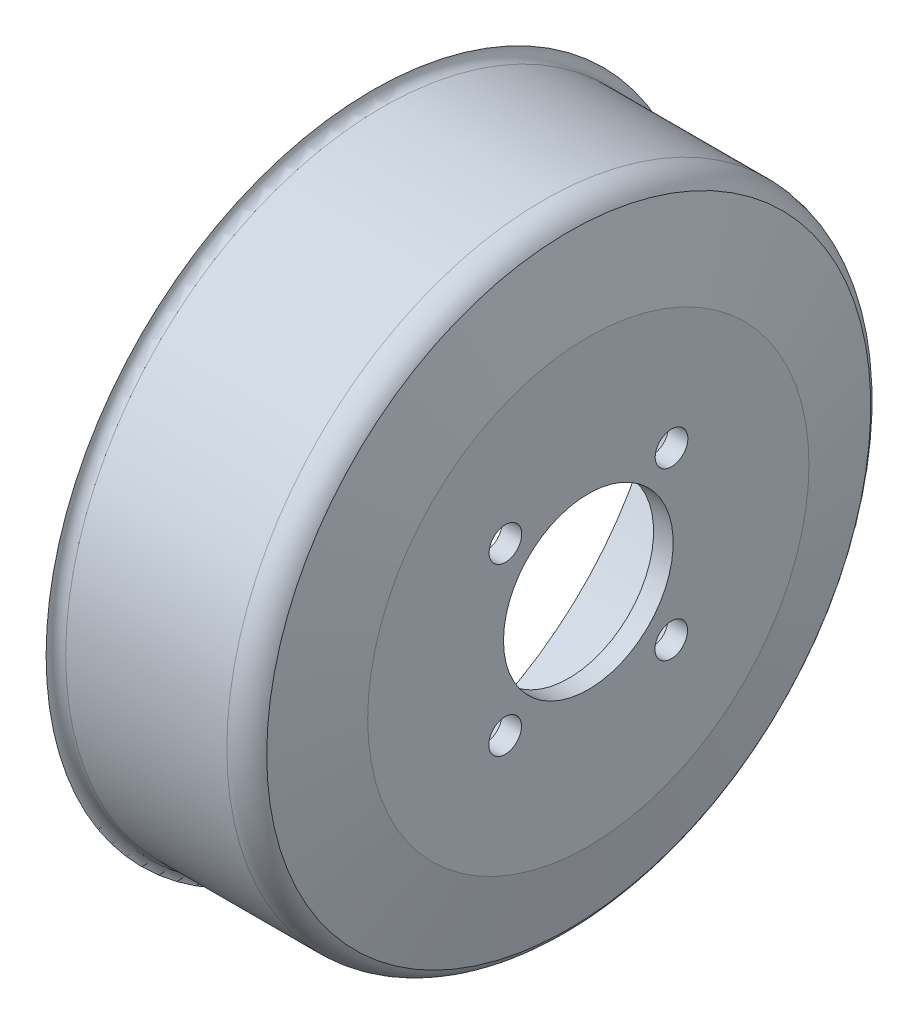
ISO-10303-21;
HEADER;
FILE_DESCRIPTION(('STEP AP214'),'2;1');
FILE_NAME('part.step','',(''),(''),'','','');
FILE_SCHEMA(('AUTOMOTIVE_DESIGN { 1 0 10303 214 1 1 1 1 }'));
ENDSEC;
DATA;
#1=APPLICATION_CONTEXT('core data for automotive mechanical design processes');
#2=APPLICATION_PROTOCOL_DEFINITION('international standard','automotive_design',2000,#1);
#3=PRODUCT_CONTEXT('',#1,'mechanical');
#4=PRODUCT('Part','Part','',(#3));
#5=PRODUCT_RELATED_PRODUCT_CATEGORY('part','',(#4));
#6=PRODUCT_DEFINITION_FORMATION('','',#4);
#7=PRODUCT_DEFINITION_CONTEXT('part definition',#1,'design');
#8=PRODUCT_DEFINITION('design','',#6,#7);
#9=PRODUCT_DEFINITION_SHAPE('','',#8);
#10=(LENGTH_UNIT() NAMED_UNIT(*) SI_UNIT(.MILLI.,.METRE.));
#11=(NAMED_UNIT(*) PLANE_ANGLE_UNIT() SI_UNIT($,.RADIAN.));
#12=(NAMED_UNIT(*) SI_UNIT($,.STERADIAN.) SOLID_ANGLE_UNIT());
#13=UNCERTAINTY_MEASURE_WITH_UNIT(LENGTH_MEASURE(1.E-05),#10,'distance_accuracy_value','');
#14=(GEOMETRIC_REPRESENTATION_CONTEXT(3) GLOBAL_UNCERTAINTY_ASSIGNED_CONTEXT((#13)) GLOBAL_UNIT_ASSIGNED_CONTEXT((#10,
#11,#12)) REPRESENTATION_CONTEXT('',''));
#15=CARTESIAN_POINT('',(0.,0.,0.));
#16=DIRECTION('',(0.,0.,1.));
#17=DIRECTION('',(1.,0.,0.));
#18=AXIS2_PLACEMENT_3D('',#15,#16,#17);
#19=CARTESIAN_POINT('',(72.1520736682351,26.,0.));
#20=DIRECTION('',(1.,0.,0.));
#21=DIRECTION('',(0.,0.,-1.));
#22=AXIS2_PLACEMENT_3D('',#19,#20,#21);
#23=PLANE('',#22);
#24=CARTESIAN_POINT('',(72.1520736682351,-25.4174602035687,25.4941702512555));
#25=DIRECTION('',(1.,0.,0.));
#26=DIRECTION('',(0.,0.,-1.));
#27=AXIS2_PLACEMENT_3D('',#24,#25,#26);
#28=CIRCLE('',#27,5.);
#29=CARTESIAN_POINT('',(72.1520736682351,-25.4174602035687,20.4941702512555));
#30=VERTEX_POINT('',#29);
#31=EDGE_CURVE('E94',#30,#30,#28,.T.);
#32=ORIENTED_EDGE('',*,*,#31,.T.);
#33=EDGE_LOOP('',(#32));
#34=FACE_BOUND('',#33,.T.);
#35=CARTESIAN_POINT('',(72.1520736682351,-25.4958558670303,-25.4157693884646));
#36=DIRECTION('',(1.,0.,0.));
#37=DIRECTION('',(0.,0.,-1.));
#38=AXIS2_PLACEMENT_3D('',#35,#36,#37);
#39=CIRCLE('',#38,5.);
#40=CARTESIAN_POINT('',(72.1520736682351,-25.4958558670303,-30.4157693884646));
#41=VERTEX_POINT('',#40);
#42=EDGE_CURVE('E98',#41,#41,#39,.T.);
#43=ORIENTED_EDGE('',*,*,#42,.T.);
#44=EDGE_LOOP('',(#43));
#45=FACE_BOUND('',#44,.T.);
#46=CARTESIAN_POINT('',(72.1520736682351,25.4141441329697,-25.4974759140712));
#47=DIRECTION('',(1.,0.,0.));
#48=DIRECTION('',(0.,0.,-1.));
#49=AXIS2_PLACEMENT_3D('',#46,#47,#48);
#50=CIRCLE('',#49,5.);
#51=CARTESIAN_POINT('',(72.1520736682351,25.4141441329697,-30.4974759140712));
#52=VERTEX_POINT('',#51);
#53=EDGE_CURVE('E102',#52,#52,#50,.T.);
#54=ORIENTED_EDGE('',*,*,#53,.T.);
#55=EDGE_LOOP('',(#54));
#56=FACE_BOUND('',#55,.T.);
#57=CARTESIAN_POINT('',(72.1520736682351,25.4990905638238,25.4125240859288));
#58=DIRECTION('',(1.,0.,0.));
#59=DIRECTION('',(0.,0.,-1.));
#60=AXIS2_PLACEMENT_3D('',#57,#58,#59);
#61=CIRCLE('',#60,5.);
#62=CARTESIAN_POINT('',(72.1520736682351,25.4990905638238,20.4125240859288));
#63=VERTEX_POINT('',#62);
#64=EDGE_CURVE('E106',#63,#63,#61,.T.);
#65=ORIENTED_EDGE('',*,*,#64,.T.);
#66=EDGE_LOOP('',(#65));
#67=FACE_BOUND('',#66,.T.);
#68=CARTESIAN_POINT('',(72.1520736682351,0.,0.));
#69=DIRECTION('',(-1.,0.,0.));
#70=DIRECTION('',(0.,0.,1.));
#71=AXIS2_PLACEMENT_3D('',#68,#69,#70);
#72=CIRCLE('',#71,26.);
#73=CARTESIAN_POINT('',(72.1520736682351,0.,26.));
#74=VERTEX_POINT('',#73);
#75=EDGE_CURVE('E10',#74,#74,#72,.T.);
#76=ORIENTED_EDGE('',*,*,#75,.F.);
#77=EDGE_LOOP('',(#76));
#78=FACE_BOUND('',#77,.T.);
#79=CARTESIAN_POINT('',(72.1520736682351,0.,0.));
#80=DIRECTION('',(-1.,0.,0.));
#81=DIRECTION('',(0.,0.,1.));
#82=AXIS2_PLACEMENT_3D('',#79,#80,#81);
#83=CIRCLE('',#82,67.613382080557);
#84=CARTESIAN_POINT('',(72.1520736682351,0.,67.613382080557));
#85=VERTEX_POINT('',#84);
#86=EDGE_CURVE('E90',#85,#85,#83,.T.);
#87=ORIENTED_EDGE('',*,*,#86,.T.);
#88=EDGE_LOOP('',(#87));
#89=FACE_BOUND('',#88,.T.);
#90=ADVANCED_FACE('F43',(#34,#45,#56,#67,#78,#89),#23,.F.);
#91=CARTESIAN_POINT('',(-30.7281618868,0.,0.));
#92=DIRECTION('',(-1.,0.,0.));
#93=DIRECTION('',(0.,0.,1.));
#94=AXIS2_PLACEMENT_3D('',#91,#92,#93);
#95=CYLINDRICAL_SURFACE('',#94,26.);
#96=CARTESIAN_POINT('',(78.1520736682351,0.,0.));
#97=DIRECTION('',(-1.,0.,0.));
#98=DIRECTION('',(0.,0.,1.));
#99=AXIS2_PLACEMENT_3D('',#96,#97,#98);
#100=CIRCLE('',#99,26.);
#101=CARTESIAN_POINT('',(78.1520736682351,0.,26.));
#102=VERTEX_POINT('',#101);
#103=EDGE_CURVE('E50',#102,#102,#100,.T.);
#104=ORIENTED_EDGE('',*,*,#103,.F.);
#105=EDGE_LOOP('',(#104));
#106=FACE_BOUND('',#105,.T.);
#107=ORIENTED_EDGE('',*,*,#75,.T.);
#108=EDGE_LOOP('',(#107));
#109=FACE_BOUND('',#108,.T.);
#110=ADVANCED_FACE('F134',(#106,#109),#95,.F.);
#111=CARTESIAN_POINT('',(78.1520736682351,26.,0.));
#112=DIRECTION('',(-1.,0.,0.));
#113=DIRECTION('',(0.,0.,1.));
#114=AXIS2_PLACEMENT_3D('',#111,#112,#113);
#115=PLANE('',#114);
#116=CARTESIAN_POINT('',(78.1520736682351,-25.4174602035687,25.4941702512555));
#117=DIRECTION('',(1.,0.,0.));
#118=DIRECTION('',(0.,0.,-1.));
#119=AXIS2_PLACEMENT_3D('',#116,#117,#118);
#120=CIRCLE('',#119,5.);
#121=CARTESIAN_POINT('',(78.1520736682351,-25.4174602035687,20.4941702512555));
#122=VERTEX_POINT('',#121);
#123=EDGE_CURVE('E115',#122,#122,#120,.T.);
#124=ORIENTED_EDGE('',*,*,#123,.F.);
#125=EDGE_LOOP('',(#124));
#126=FACE_BOUND('',#125,.T.);
#127=CARTESIAN_POINT('',(78.1520736682351,-25.4958558670303,-25.4157693884646));
#128=DIRECTION('',(1.,0.,0.));
#129=DIRECTION('',(0.,0.,-1.));
#130=AXIS2_PLACEMENT_3D('',#127,#128,#129);
#131=CIRCLE('',#130,5.);
#132=CARTESIAN_POINT('',(78.1520736682351,-25.4958558670303,-30.4157693884646));
#133=VERTEX_POINT('',#132);
#134=EDGE_CURVE('E119',#133,#133,#131,.T.);
#135=ORIENTED_EDGE('',*,*,#134,.F.);
#136=EDGE_LOOP('',(#135));
#137=FACE_BOUND('',#136,.T.);
#138=CARTESIAN_POINT('',(78.1520736682351,25.4141441329697,-25.4974759140712));
#139=DIRECTION('',(1.,0.,0.));
#140=DIRECTION('',(0.,0.,-1.));
#141=AXIS2_PLACEMENT_3D('',#138,#139,#140);
#142=CIRCLE('',#141,5.);
#143=CARTESIAN_POINT('',(78.1520736682351,25.4141441329697,-30.4974759140712));
#144=VERTEX_POINT('',#143);
#145=EDGE_CURVE('E114',#144,#144,#142,.T.);
#146=ORIENTED_EDGE('',*,*,#145,.F.);
#147=EDGE_LOOP('',(#146));
#148=FACE_BOUND('',#147,.T.);
#149=CARTESIAN_POINT('',(78.1520736682351,25.4990905638238,25.4125240859288));
#150=DIRECTION('',(1.,0.,0.));
#151=DIRECTION('',(0.,0.,-1.));
#152=AXIS2_PLACEMENT_3D('',#149,#150,#151);
#153=CIRCLE('',#152,5.);
#154=CARTESIAN_POINT('',(78.1520736682351,25.4990905638238,20.4125240859288));
#155=VERTEX_POINT('',#154);
#156=EDGE_CURVE('E110',#155,#155,#153,.T.);
#157=ORIENTED_EDGE('',*,*,#156,.F.);
#158=EDGE_LOOP('',(#157));
#159=FACE_BOUND('',#158,.T.);
#160=CARTESIAN_POINT('',(78.1520736682351,0.,0.));
#161=DIRECTION('',(-1.,0.,0.));
#162=DIRECTION('',(0.,0.,1.));
#163=AXIS2_PLACEMENT_3D('',#160,#161,#162);
#164=CIRCLE('',#163,67.613382080557);
#165=CARTESIAN_POINT('',(78.1520736682351,0.,67.613382080557));
#166=VERTEX_POINT('',#165);
#167=EDGE_CURVE('E55',#166,#166,#164,.T.);
#168=ORIENTED_EDGE('',*,*,#167,.F.);
#169=EDGE_LOOP('',(#168));
#170=FACE_BOUND('',#169,.T.);
#171=ORIENTED_EDGE('',*,*,#103,.T.);
#172=EDGE_LOOP('',(#171));
#173=FACE_BOUND('',#172,.T.);
#174=ADVANCED_FACE('F130',(#126,#137,#148,#159,#170,#173),#115,.F.);
#175=CARTESIAN_POINT('',(78.1520736682351,0.,0.));
#176=DIRECTION('',(-1.,0.,0.));
#177=DIRECTION('',(0.,0.,1.));
#178=AXIS2_PLACEMENT_3D('',#175,#176,#177);
#179=CONICAL_SURFACE('',#178,67.613382080557,1.33460410342848);
#180=CARTESIAN_POINT('',(72.1520736682351,0.,0.));
#181=DIRECTION('',(-1.,0.,0.));
#182=DIRECTION('',(0.,0.,1.));
#183=AXIS2_PLACEMENT_3D('',#180,#181,#182);
#184=CIRCLE('',#183,92.5422692859803);
#185=CARTESIAN_POINT('',(72.1520736682351,0.,92.5422692859803));
#186=VERTEX_POINT('',#185);
#187=EDGE_CURVE('E60',#186,#186,#184,.T.);
#188=ORIENTED_EDGE('',*,*,#187,.F.);
#189=EDGE_LOOP('',(#188));
#190=FACE_BOUND('',#189,.T.);
#191=ORIENTED_EDGE('',*,*,#167,.T.);
#192=EDGE_LOOP('',(#191));
#193=FACE_BOUND('',#192,.T.);
#194=ADVANCED_FACE('F133',(#190,#193),#179,.T.);
#195=CARTESIAN_POINT('',(64.3824025211633,0.,0.));
#196=DIRECTION('',(-1.,0.,0.));
#197=DIRECTION('',(0.,0.,1.));
#198=AXIS2_PLACEMENT_3D('',#195,#196,#197);
#199=TOROIDAL_SURFACE('',#198,88.,9.00000000000001);
#200=CARTESIAN_POINT('',(64.3824025211633,0.,0.));
#201=DIRECTION('',(-1.,0.,0.));
#202=DIRECTION('',(0.,0.,1.));
#203=AXIS2_PLACEMENT_3D('',#200,#201,#202);
#204=CIRCLE('',#203,97.);
#205=CARTESIAN_POINT('',(64.3824025211633,0.,97.));
#206=VERTEX_POINT('',#205);
#207=EDGE_CURVE('E66',#206,#206,#204,.T.);
#208=ORIENTED_EDGE('',*,*,#207,.F.);
#209=EDGE_LOOP('',(#208));
#210=FACE_BOUND('',#209,.T.);
#211=ORIENTED_EDGE('',*,*,#187,.T.);
#212=EDGE_LOOP('',(#211));
#213=FACE_BOUND('',#212,.T.);
#214=ADVANCED_FACE('F142',(#210,#213),#199,.T.);
#215=CARTESIAN_POINT('',(-30.7281618868,0.,0.));
#216=DIRECTION('',(-1.,0.,0.));
#217=DIRECTION('',(0.,0.,1.));
#218=AXIS2_PLACEMENT_3D('',#215,#216,#217);
#219=CYLINDRICAL_SURFACE('',#218,97.);
#220=CARTESIAN_POINT('',(15.,0.,0.));
#221=DIRECTION('',(-1.,0.,0.));
#222=DIRECTION('',(0.,0.,1.));
#223=AXIS2_PLACEMENT_3D('',#220,#221,#222);
#224=CIRCLE('',#223,97.);
#225=CARTESIAN_POINT('',(15.,0.,97.));
#226=VERTEX_POINT('',#225);
#227=EDGE_CURVE('E70',#226,#226,#224,.T.);
#228=ORIENTED_EDGE('',*,*,#227,.F.);
#229=EDGE_LOOP('',(#228));
#230=FACE_BOUND('',#229,.T.);
#231=ORIENTED_EDGE('',*,*,#207,.T.);
#232=EDGE_LOOP('',(#231));
#233=FACE_BOUND('',#232,.T.);
#234=ADVANCED_FACE('F149',(#230,#233),#219,.T.);
#235=CARTESIAN_POINT('',(15.,0.,0.));
#236=DIRECTION('',(-1.,0.,0.));
#237=DIRECTION('',(0.,0.,1.));
#238=AXIS2_PLACEMENT_3D('',#235,#236,#237);
#239=TOROIDAL_SURFACE('',#238,100.,3.);
#240=CARTESIAN_POINT('',(12.,0.,0.));
#241=DIRECTION('',(-1.,0.,0.));
#242=DIRECTION('',(0.,0.,1.));
#243=AXIS2_PLACEMENT_3D('',#240,#241,#242);
#244=CIRCLE('',#243,100.);
#245=CARTESIAN_POINT('',(12.,0.,100.));
#246=VERTEX_POINT('',#245);
#247=EDGE_CURVE('E74',#246,#246,#244,.T.);
#248=ORIENTED_EDGE('',*,*,#247,.F.);
#249=EDGE_LOOP('',(#248));
#250=FACE_BOUND('',#249,.T.);
#251=ORIENTED_EDGE('',*,*,#227,.T.);
#252=EDGE_LOOP('',(#251));
#253=FACE_BOUND('',#252,.T.);
#254=ADVANCED_FACE('F191',(#250,#253),#239,.F.);
#255=CARTESIAN_POINT('',(12.,91.,0.));
#256=DIRECTION('',(1.,0.,0.));
#257=DIRECTION('',(0.,0.,-1.));
#258=AXIS2_PLACEMENT_3D('',#255,#256,#257);
#259=PLANE('',#258);
#260=CARTESIAN_POINT('',(12.,0.,0.));
#261=DIRECTION('',(-1.,0.,0.));
#262=DIRECTION('',(0.,0.,1.));
#263=AXIS2_PLACEMENT_3D('',#260,#261,#262);
#264=CIRCLE('',#263,91.);
#265=CARTESIAN_POINT('',(12.,0.,91.));
#266=VERTEX_POINT('',#265);
#267=EDGE_CURVE('E78',#266,#266,#264,.T.);
#268=ORIENTED_EDGE('',*,*,#267,.F.);
#269=EDGE_LOOP('',(#268));
#270=FACE_BOUND('',#269,.T.);
#271=ORIENTED_EDGE('',*,*,#247,.T.);
#272=EDGE_LOOP('',(#271));
#273=FACE_BOUND('',#272,.T.);
#274=ADVANCED_FACE('F185',(#270,#273),#259,.F.);
#275=CARTESIAN_POINT('',(-30.7281618868,0.,0.));
#276=DIRECTION('',(-1.,0.,0.));
#277=DIRECTION('',(0.,0.,1.));
#278=AXIS2_PLACEMENT_3D('',#275,#276,#277);
#279=CYLINDRICAL_SURFACE('',#278,91.);
#280=CARTESIAN_POINT('',(63.8183032100698,0.,0.));
#281=DIRECTION('',(-1.,0.,0.));
#282=DIRECTION('',(0.,0.,1.));
#283=AXIS2_PLACEMENT_3D('',#280,#281,#282);
#284=CIRCLE('',#283,91.);
#285=CARTESIAN_POINT('',(63.8183032100698,0.,91.));
#286=VERTEX_POINT('',#285);
#287=EDGE_CURVE('E82',#286,#286,#284,.T.);
#288=ORIENTED_EDGE('',*,*,#287,.F.);
#289=EDGE_LOOP('',(#288));
#290=FACE_BOUND('',#289,.T.);
#291=ORIENTED_EDGE('',*,*,#267,.T.);
#292=EDGE_LOOP('',(#291));
#293=FACE_BOUND('',#292,.T.);
#294=ADVANCED_FACE('F179',(#290,#293),#279,.F.);
#295=CARTESIAN_POINT('',(63.8183032100698,0.,0.));
#296=DIRECTION('',(-1.,0.,0.));
#297=DIRECTION('',(0.,0.,1.));
#298=AXIS2_PLACEMENT_3D('',#295,#296,#297);
#299=TOROIDAL_SURFACE('',#298,88.0402002176648,2.95979978233515);
#300=CARTESIAN_POINT('',(66.4081935924271,0.,0.));
#301=DIRECTION('',(-1.,0.,0.));
#302=DIRECTION('',(0.,0.,1.));
#303=AXIS2_PLACEMENT_3D('',#300,#301,#302);
#304=CIRCLE('',#303,89.4729886036048);
#305=CARTESIAN_POINT('',(66.4081935924271,0.,89.4729886036048));
#306=VERTEX_POINT('',#305);
#307=EDGE_CURVE('E86',#306,#306,#304,.T.);
#308=ORIENTED_EDGE('',*,*,#307,.F.);
#309=EDGE_LOOP('',(#308));
#310=FACE_BOUND('',#309,.T.);
#311=ORIENTED_EDGE('',*,*,#287,.T.);
#312=EDGE_LOOP('',(#311));
#313=FACE_BOUND('',#312,.T.);
#314=ADVANCED_FACE('F173',(#310,#313),#299,.F.);
#315=CARTESIAN_POINT('',(66.4081935924271,0.,0.));
#316=DIRECTION('',(-1.,0.,0.));
#317=DIRECTION('',(0.,0.,1.));
#318=AXIS2_PLACEMENT_3D('',#315,#316,#317);
#319=CONICAL_SURFACE('',#318,89.4729886036048,1.31384263874722);
#320=ORIENTED_EDGE('',*,*,#86,.F.);
#321=EDGE_LOOP('',(#320));
#322=FACE_BOUND('',#321,.T.);
#323=ORIENTED_EDGE('',*,*,#307,.T.);
#324=EDGE_LOOP('',(#323));
#325=FACE_BOUND('',#324,.T.);
#326=ADVANCED_FACE('F170',(#322,#325),#319,.F.);
#327=CARTESIAN_POINT('',(68.1520736682351,25.4990905638238,25.4125240859288));
#328=DIRECTION('',(1.,0.,0.));
#329=DIRECTION('',(0.,0.,-1.));
#330=AXIS2_PLACEMENT_3D('',#327,#328,#329);
#331=CYLINDRICAL_SURFACE('',#330,5.);
#332=ORIENTED_EDGE('',*,*,#156,.T.);
#333=EDGE_LOOP('',(#332));
#334=FACE_BOUND('',#333,.T.);
#335=ORIENTED_EDGE('',*,*,#64,.F.);
#336=EDGE_LOOP('',(#335));
#337=FACE_BOUND('',#336,.T.);
#338=ADVANCED_FACE('F172',(#334,#337),#331,.F.);
#339=CARTESIAN_POINT('',(68.1520736682351,25.4141441329697,-25.4974759140712));
#340=DIRECTION('',(1.,0.,0.));
#341=DIRECTION('',(0.,0.,-1.));
#342=AXIS2_PLACEMENT_3D('',#339,#340,#341);
#343=CYLINDRICAL_SURFACE('',#342,5.);
#344=ORIENTED_EDGE('',*,*,#145,.T.);
#345=EDGE_LOOP('',(#344));
#346=FACE_BOUND('',#345,.T.);
#347=ORIENTED_EDGE('',*,*,#53,.F.);
#348=EDGE_LOOP('',(#347));
#349=FACE_BOUND('',#348,.T.);
#350=ADVANCED_FACE('F127',(#346,#349),#343,.F.);
#351=CARTESIAN_POINT('',(68.1520736682351,-25.4958558670303,-25.4157693884646));
#352=DIRECTION('',(1.,0.,0.));
#353=DIRECTION('',(0.,0.,-1.));
#354=AXIS2_PLACEMENT_3D('',#351,#352,#353);
#355=CYLINDRICAL_SURFACE('',#354,5.);
#356=ORIENTED_EDGE('',*,*,#134,.T.);
#357=EDGE_LOOP('',(#356));
#358=FACE_BOUND('',#357,.T.);
#359=ORIENTED_EDGE('',*,*,#42,.F.);
#360=EDGE_LOOP('',(#359));
#361=FACE_BOUND('',#360,.T.);
#362=ADVANCED_FACE('F214',(#358,#361),#355,.F.);
#363=CARTESIAN_POINT('',(68.1520736682351,-25.4174602035687,25.4941702512555));
#364=DIRECTION('',(1.,0.,0.));
#365=DIRECTION('',(0.,0.,-1.));
#366=AXIS2_PLACEMENT_3D('',#363,#364,#365);
#367=CYLINDRICAL_SURFACE('',#366,5.);
#368=ORIENTED_EDGE('',*,*,#123,.T.);
#369=EDGE_LOOP('',(#368));
#370=FACE_BOUND('',#369,.T.);
#371=ORIENTED_EDGE('',*,*,#31,.F.);
#372=EDGE_LOOP('',(#371));
#373=FACE_BOUND('',#372,.T.);
#374=ADVANCED_FACE('F211',(#370,#373),#367,.F.);
#375=CLOSED_SHELL('',(#90,#110,#174,#194,#214,#234,#254,#274,#294,#314,#326,#338,#350,#362,#374));
#376=MANIFOLD_SOLID_BREP('B2',#375);
#377=ADVANCED_BREP_SHAPE_REPRESENTATION('',(#18,#376),#14);
#378=SHAPE_DEFINITION_REPRESENTATION(#9,#377);
ENDSEC;
END-ISO-10303-21;
